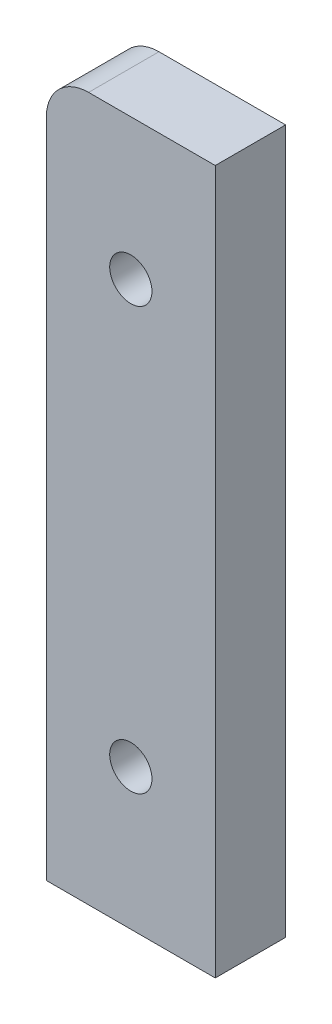
ISO-10303-21;
HEADER;
FILE_DESCRIPTION(('STEP AP214'),'2;1');
FILE_NAME('part.step','',(''),(''),'','','');
FILE_SCHEMA(('AUTOMOTIVE_DESIGN { 1 0 10303 214 1 1 1 1 }'));
ENDSEC;
DATA;
#1=APPLICATION_CONTEXT('core data for automotive mechanical design processes');
#2=APPLICATION_PROTOCOL_DEFINITION('international standard','automotive_design',2000,#1);
#3=PRODUCT_CONTEXT('',#1,'mechanical');
#4=PRODUCT('Part','Part','',(#3));
#5=PRODUCT_RELATED_PRODUCT_CATEGORY('part','',(#4));
#6=PRODUCT_DEFINITION_FORMATION('','',#4);
#7=PRODUCT_DEFINITION_CONTEXT('part definition',#1,'design');
#8=PRODUCT_DEFINITION('design','',#6,#7);
#9=PRODUCT_DEFINITION_SHAPE('','',#8);
#10=(LENGTH_UNIT() NAMED_UNIT(*) SI_UNIT(.MILLI.,.METRE.));
#11=(NAMED_UNIT(*) PLANE_ANGLE_UNIT() SI_UNIT($,.RADIAN.));
#12=(NAMED_UNIT(*) SI_UNIT($,.STERADIAN.) SOLID_ANGLE_UNIT());
#13=UNCERTAINTY_MEASURE_WITH_UNIT(LENGTH_MEASURE(1.E-05),#10,'distance_accuracy_value','');
#14=(GEOMETRIC_REPRESENTATION_CONTEXT(3) GLOBAL_UNCERTAINTY_ASSIGNED_CONTEXT((#13)) GLOBAL_UNIT_ASSIGNED_CONTEXT((#10,
#11,#12)) REPRESENTATION_CONTEXT('',''));
#15=CARTESIAN_POINT('',(0.,0.,0.));
#16=DIRECTION('',(0.,0.,1.));
#17=DIRECTION('',(1.,0.,0.));
#18=AXIS2_PLACEMENT_3D('',#15,#16,#17);
#19=CARTESIAN_POINT('',(6.,-25.,5.));
#20=DIRECTION('',(-1.,0.,0.));
#21=DIRECTION('',(0.,0.,1.));
#22=AXIS2_PLACEMENT_3D('',#19,#20,#21);
#23=PLANE('',#22);
#24=DIRECTION('',(0.,1.,0.));
#25=VECTOR('',#24,1.);
#26=CARTESIAN_POINT('',(6.,-25.,0.));
#27=LINE('',#26,#25);
#28=CARTESIAN_POINT('',(6.,-25.,0.));
#29=VERTEX_POINT('',#28);
#30=CARTESIAN_POINT('',(6.,25.,0.));
#31=VERTEX_POINT('',#30);
#32=EDGE_CURVE('E98',#29,#31,#27,.T.);
#33=ORIENTED_EDGE('',*,*,#32,.T.);
#34=DIRECTION('',(0.,0.,-1.));
#35=VECTOR('',#34,1.);
#36=CARTESIAN_POINT('',(6.,25.,5.));
#37=LINE('',#36,#35);
#38=CARTESIAN_POINT('',(6.,25.,5.));
#39=VERTEX_POINT('',#38);
#40=EDGE_CURVE('E81',#39,#31,#37,.T.);
#41=ORIENTED_EDGE('',*,*,#40,.F.);
#42=DIRECTION('',(0.,1.,0.));
#43=VECTOR('',#42,1.);
#44=CARTESIAN_POINT('',(6.,-25.,5.));
#45=LINE('',#44,#43);
#46=CARTESIAN_POINT('',(6.,-25.,5.));
#47=VERTEX_POINT('',#46);
#48=EDGE_CURVE('E86',#47,#39,#45,.T.);
#49=ORIENTED_EDGE('',*,*,#48,.F.);
#50=DIRECTION('',(0.,0.,-1.));
#51=VECTOR('',#50,1.);
#52=CARTESIAN_POINT('',(6.,-25.,5.));
#53=LINE('',#52,#51);
#54=EDGE_CURVE('E105',#47,#29,#53,.T.);
#55=ORIENTED_EDGE('',*,*,#54,.T.);
#56=EDGE_LOOP('',(#33,#41,#49,#55));
#57=FACE_BOUND('',#56,.T.);
#58=ADVANCED_FACE('F34',(#57),#23,.F.);
#59=CARTESIAN_POINT('',(-6.,25.,5.));
#60=DIRECTION('',(0.,-1.,0.));
#61=DIRECTION('',(0.,0.,-1.));
#62=AXIS2_PLACEMENT_3D('',#59,#60,#61);
#63=PLANE('',#62);
#64=DIRECTION('',(-1.,0.,0.));
#65=VECTOR('',#64,1.);
#66=CARTESIAN_POINT('',(-6.,25.,0.));
#67=LINE('',#66,#65);
#68=CARTESIAN_POINT('',(-3.,25.,0.));
#69=VERTEX_POINT('',#68);
#70=EDGE_CURVE('E113',#31,#69,#67,.T.);
#71=ORIENTED_EDGE('',*,*,#70,.T.);
#72=DIRECTION('',(0.,0.,-1.));
#73=VECTOR('',#72,1.);
#74=CARTESIAN_POINT('',(-3.,25.,5.));
#75=LINE('',#74,#73);
#76=CARTESIAN_POINT('',(-3.,25.,5.));
#77=VERTEX_POINT('',#76);
#78=EDGE_CURVE('E42',#69,#77,#75,.F.);
#79=ORIENTED_EDGE('',*,*,#78,.T.);
#80=DIRECTION('',(-1.,0.,0.));
#81=VECTOR('',#80,1.);
#82=CARTESIAN_POINT('',(-6.,25.,5.));
#83=LINE('',#82,#81);
#84=EDGE_CURVE('E77',#39,#77,#83,.T.);
#85=ORIENTED_EDGE('',*,*,#84,.F.);
#86=ORIENTED_EDGE('',*,*,#40,.T.);
#87=EDGE_LOOP('',(#71,#79,#85,#86));
#88=FACE_BOUND('',#87,.T.);
#89=ADVANCED_FACE('F79',(#88),#63,.F.);
#90=CARTESIAN_POINT('',(-6.,-25.,5.));
#91=DIRECTION('',(1.,0.,0.));
#92=DIRECTION('',(0.,0.,-1.));
#93=AXIS2_PLACEMENT_3D('',#90,#91,#92);
#94=PLANE('',#93);
#95=DIRECTION('',(0.,-1.,0.));
#96=VECTOR('',#95,1.);
#97=CARTESIAN_POINT('',(-6.,-25.,5.));
#98=LINE('',#97,#96);
#99=CARTESIAN_POINT('',(-6.,22.,5.));
#100=VERTEX_POINT('',#99);
#101=CARTESIAN_POINT('',(-6.,-25.,5.));
#102=VERTEX_POINT('',#101);
#103=EDGE_CURVE('E85',#100,#102,#98,.T.);
#104=ORIENTED_EDGE('',*,*,#103,.F.);
#105=DIRECTION('',(0.,0.,-1.));
#106=VECTOR('',#105,1.);
#107=CARTESIAN_POINT('',(-6.,22.,5.));
#108=LINE('',#107,#106);
#109=CARTESIAN_POINT('',(-6.,22.,0.));
#110=VERTEX_POINT('',#109);
#111=EDGE_CURVE('E99',#100,#110,#108,.T.);
#112=ORIENTED_EDGE('',*,*,#111,.T.);
#113=DIRECTION('',(0.,-1.,0.));
#114=VECTOR('',#113,1.);
#115=CARTESIAN_POINT('',(-6.,-25.,0.));
#116=LINE('',#115,#114);
#117=CARTESIAN_POINT('',(-6.,-25.,0.));
#118=VERTEX_POINT('',#117);
#119=EDGE_CURVE('E111',#110,#118,#116,.T.);
#120=ORIENTED_EDGE('',*,*,#119,.T.);
#121=DIRECTION('',(0.,0.,-1.));
#122=VECTOR('',#121,1.);
#123=CARTESIAN_POINT('',(-6.,-25.,5.));
#124=LINE('',#123,#122);
#125=EDGE_CURVE('E100',#102,#118,#124,.T.);
#126=ORIENTED_EDGE('',*,*,#125,.F.);
#127=EDGE_LOOP('',(#104,#112,#120,#126));
#128=FACE_BOUND('',#127,.T.);
#129=ADVANCED_FACE('F144',(#128),#94,.F.);
#130=CARTESIAN_POINT('',(-6.,-25.,5.));
#131=DIRECTION('',(0.,1.,0.));
#132=DIRECTION('',(0.,0.,1.));
#133=AXIS2_PLACEMENT_3D('',#130,#131,#132);
#134=PLANE('',#133);
#135=DIRECTION('',(1.,0.,0.));
#136=VECTOR('',#135,1.);
#137=CARTESIAN_POINT('',(-6.,-25.,0.));
#138=LINE('',#137,#136);
#139=EDGE_CURVE('E95',#118,#29,#138,.T.);
#140=ORIENTED_EDGE('',*,*,#139,.T.);
#141=ORIENTED_EDGE('',*,*,#54,.F.);
#142=DIRECTION('',(1.,0.,0.));
#143=VECTOR('',#142,1.);
#144=CARTESIAN_POINT('',(-6.,-25.,5.));
#145=LINE('',#144,#143);
#146=EDGE_CURVE('E91',#102,#47,#145,.T.);
#147=ORIENTED_EDGE('',*,*,#146,.F.);
#148=ORIENTED_EDGE('',*,*,#125,.T.);
#149=EDGE_LOOP('',(#140,#141,#147,#148));
#150=FACE_BOUND('',#149,.T.);
#151=ADVANCED_FACE('F147',(#150),#134,.F.);
#152=CARTESIAN_POINT('',(0.,0.,5.));
#153=DIRECTION('',(0.,0.,-1.));
#154=DIRECTION('',(-1.,0.,0.));
#155=AXIS2_PLACEMENT_3D('',#152,#153,#154);
#156=PLANE('',#155);
#157=CARTESIAN_POINT('',(0.,-15.,5.));
#158=DIRECTION('',(0.,0.,-1.));
#159=DIRECTION('',(1.,0.,0.));
#160=AXIS2_PLACEMENT_3D('',#157,#158,#159);
#161=CIRCLE('',#160,1.5);
#162=CARTESIAN_POINT('',(1.5,-15.,5.));
#163=VERTEX_POINT('',#162);
#164=EDGE_CURVE('E125',#163,#163,#161,.T.);
#165=ORIENTED_EDGE('',*,*,#164,.T.);
#166=EDGE_LOOP('',(#165));
#167=FACE_BOUND('',#166,.T.);
#168=CARTESIAN_POINT('',(0.,15.,5.));
#169=DIRECTION('',(0.,0.,1.));
#170=DIRECTION('',(1.,0.,0.));
#171=AXIS2_PLACEMENT_3D('',#168,#169,#170);
#172=CIRCLE('',#171,1.5);
#173=CARTESIAN_POINT('',(1.5,15.,5.));
#174=VERTEX_POINT('',#173);
#175=EDGE_CURVE('E119',#174,#174,#172,.T.);
#176=ORIENTED_EDGE('',*,*,#175,.F.);
#177=EDGE_LOOP('',(#176));
#178=FACE_BOUND('',#177,.T.);
#179=ORIENTED_EDGE('',*,*,#84,.T.);
#180=CARTESIAN_POINT('',(-3.,22.,5.));
#181=DIRECTION('',(0.,0.,-1.));
#182=DIRECTION('',(-1.,0.,0.));
#183=AXIS2_PLACEMENT_3D('',#180,#181,#182);
#184=CIRCLE('',#183,3.);
#185=EDGE_CURVE('E11',#77,#100,#184,.F.);
#186=ORIENTED_EDGE('',*,*,#185,.T.);
#187=ORIENTED_EDGE('',*,*,#103,.T.);
#188=ORIENTED_EDGE('',*,*,#146,.T.);
#189=ORIENTED_EDGE('',*,*,#48,.T.);
#190=EDGE_LOOP('',(#179,#186,#187,#188,#189));
#191=FACE_BOUND('',#190,.T.);
#192=ADVANCED_FACE('F89',(#167,#178,#191),#156,.F.);
#193=CARTESIAN_POINT('',(0.,0.,0.));
#194=DIRECTION('',(0.,0.,-1.));
#195=DIRECTION('',(-1.,0.,0.));
#196=AXIS2_PLACEMENT_3D('',#193,#194,#195);
#197=PLANE('',#196);
#198=CARTESIAN_POINT('',(0.,-15.,0.));
#199=DIRECTION('',(0.,0.,-1.));
#200=DIRECTION('',(1.,0.,0.));
#201=AXIS2_PLACEMENT_3D('',#198,#199,#200);
#202=CIRCLE('',#201,1.5);
#203=CARTESIAN_POINT('',(1.5,-15.,0.));
#204=VERTEX_POINT('',#203);
#205=EDGE_CURVE('E122',#204,#204,#202,.T.);
#206=ORIENTED_EDGE('',*,*,#205,.F.);
#207=EDGE_LOOP('',(#206));
#208=FACE_BOUND('',#207,.T.);
#209=CARTESIAN_POINT('',(0.,15.,0.));
#210=DIRECTION('',(0.,0.,1.));
#211=DIRECTION('',(1.,0.,0.));
#212=AXIS2_PLACEMENT_3D('',#209,#210,#211);
#213=CIRCLE('',#212,1.5);
#214=CARTESIAN_POINT('',(1.5,15.,0.));
#215=VERTEX_POINT('',#214);
#216=EDGE_CURVE('E116',#215,#215,#213,.T.);
#217=ORIENTED_EDGE('',*,*,#216,.T.);
#218=EDGE_LOOP('',(#217));
#219=FACE_BOUND('',#218,.T.);
#220=ORIENTED_EDGE('',*,*,#119,.F.);
#221=CARTESIAN_POINT('',(-3.,22.,0.));
#222=DIRECTION('',(0.,0.,-1.));
#223=DIRECTION('',(-1.,0.,0.));
#224=AXIS2_PLACEMENT_3D('',#221,#222,#223);
#225=CIRCLE('',#224,3.);
#226=EDGE_CURVE('E56',#110,#69,#225,.T.);
#227=ORIENTED_EDGE('',*,*,#226,.T.);
#228=ORIENTED_EDGE('',*,*,#70,.F.);
#229=ORIENTED_EDGE('',*,*,#32,.F.);
#230=ORIENTED_EDGE('',*,*,#139,.F.);
#231=EDGE_LOOP('',(#220,#227,#228,#229,#230));
#232=FACE_BOUND('',#231,.T.);
#233=ADVANCED_FACE('F134',(#208,#219,#232),#197,.T.);
#234=CARTESIAN_POINT('',(0.,15.,0.));
#235=DIRECTION('',(0.,0.,1.));
#236=DIRECTION('',(1.,0.,0.));
#237=AXIS2_PLACEMENT_3D('',#234,#235,#236);
#238=CYLINDRICAL_SURFACE('',#237,1.5);
#239=ORIENTED_EDGE('',*,*,#216,.F.);
#240=EDGE_LOOP('',(#239));
#241=FACE_BOUND('',#240,.T.);
#242=ORIENTED_EDGE('',*,*,#175,.T.);
#243=EDGE_LOOP('',(#242));
#244=FACE_BOUND('',#243,.T.);
#245=ADVANCED_FACE('F137',(#241,#244),#238,.F.);
#246=CARTESIAN_POINT('',(0.,-15.,0.));
#247=DIRECTION('',(0.,0.,1.));
#248=DIRECTION('',(1.,0.,0.));
#249=AXIS2_PLACEMENT_3D('',#246,#247,#248);
#250=CYLINDRICAL_SURFACE('',#249,1.5);
#251=ORIENTED_EDGE('',*,*,#205,.T.);
#252=EDGE_LOOP('',(#251));
#253=FACE_BOUND('',#252,.T.);
#254=ORIENTED_EDGE('',*,*,#164,.F.);
#255=EDGE_LOOP('',(#254));
#256=FACE_BOUND('',#255,.T.);
#257=ADVANCED_FACE('F131',(#253,#256),#250,.F.);
#258=CARTESIAN_POINT('',(-3.,22.,5.));
#259=DIRECTION('',(0.,0.,-1.));
#260=DIRECTION('',(-1.,0.,0.));
#261=AXIS2_PLACEMENT_3D('',#258,#259,#260);
#262=CYLINDRICAL_SURFACE('',#261,3.);
#263=ORIENTED_EDGE('',*,*,#185,.F.);
#264=ORIENTED_EDGE('',*,*,#78,.F.);
#265=ORIENTED_EDGE('',*,*,#226,.F.);
#266=ORIENTED_EDGE('',*,*,#111,.F.);
#267=EDGE_LOOP('',(#263,#264,#265,#266));
#268=FACE_BOUND('',#267,.T.);
#269=ADVANCED_FACE('F36',(#268),#262,.T.);
#270=CLOSED_SHELL('',(#58,#89,#129,#151,#192,#233,#245,#257,#269));
#271=MANIFOLD_SOLID_BREP('B2',#270);
#272=ADVANCED_BREP_SHAPE_REPRESENTATION('',(#18,#271),#14);
#273=SHAPE_DEFINITION_REPRESENTATION(#9,#272);
ENDSEC;
END-ISO-10303-21;
